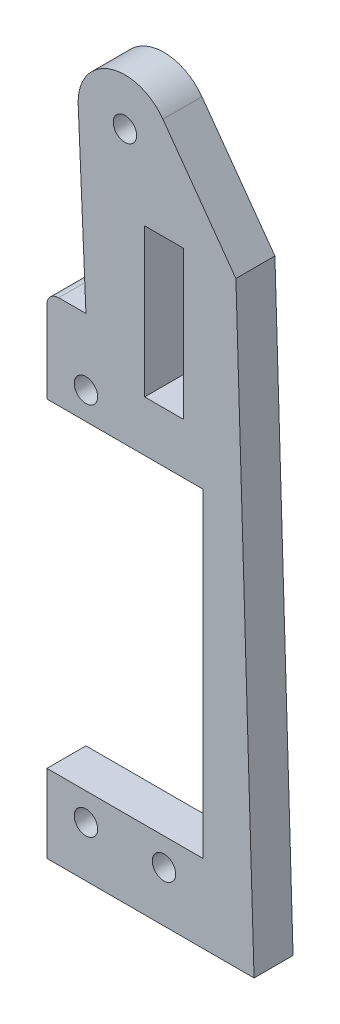
ISO-10303-21;
HEADER;
FILE_DESCRIPTION(('STEP AP214'),'2;1');
FILE_NAME('part.step','',(''),(''),'','','');
FILE_SCHEMA(('AUTOMOTIVE_DESIGN { 1 0 10303 214 1 1 1 1 }'));
ENDSEC;
DATA;
#1=APPLICATION_CONTEXT('core data for automotive mechanical design processes');
#2=APPLICATION_PROTOCOL_DEFINITION('international standard','automotive_design',2000,#1);
#3=PRODUCT_CONTEXT('',#1,'mechanical');
#4=PRODUCT('Part','Part','',(#3));
#5=PRODUCT_RELATED_PRODUCT_CATEGORY('part','',(#4));
#6=PRODUCT_DEFINITION_FORMATION('','',#4);
#7=PRODUCT_DEFINITION_CONTEXT('part definition',#1,'design');
#8=PRODUCT_DEFINITION('design','',#6,#7);
#9=PRODUCT_DEFINITION_SHAPE('','',#8);
#10=(LENGTH_UNIT() NAMED_UNIT(*) SI_UNIT(.MILLI.,.METRE.));
#11=(NAMED_UNIT(*) PLANE_ANGLE_UNIT() SI_UNIT($,.RADIAN.));
#12=(NAMED_UNIT(*) SI_UNIT($,.STERADIAN.) SOLID_ANGLE_UNIT());
#13=UNCERTAINTY_MEASURE_WITH_UNIT(LENGTH_MEASURE(1.E-05),#10,'distance_accuracy_value','');
#14=(GEOMETRIC_REPRESENTATION_CONTEXT(3) GLOBAL_UNCERTAINTY_ASSIGNED_CONTEXT((#13)) GLOBAL_UNIT_ASSIGNED_CONTEXT((#10,
#11,#12)) REPRESENTATION_CONTEXT('',''));
#15=CARTESIAN_POINT('',(0.,0.,0.));
#16=DIRECTION('',(0.,0.,1.));
#17=DIRECTION('',(1.,0.,0.));
#18=AXIS2_PLACEMENT_3D('',#15,#16,#17);
#19=CARTESIAN_POINT('',(17.5288568297002,0.,5.));
#20=DIRECTION('',(-1.,0.,0.));
#21=DIRECTION('',(0.,-1.,0.));
#22=AXIS2_PLACEMENT_3D('',#19,#20,#21);
#23=PLANE('',#22);
#24=DIRECTION('',(0.,1.,0.));
#25=VECTOR('',#24,1.);
#26=CARTESIAN_POINT('',(17.5288568297002,0.,0.));
#27=LINE('',#26,#25);
#28=CARTESIAN_POINT('',(17.5288568297002,57.4999999999998,0.));
#29=VERTEX_POINT('',#28);
#30=CARTESIAN_POINT('',(17.5288568297002,76.4999999999998,0.));
#31=VERTEX_POINT('',#30);
#32=EDGE_CURVE('E251',#29,#31,#27,.T.);
#33=ORIENTED_EDGE('',*,*,#32,.F.);
#34=DIRECTION('',(0.,0.,-1.));
#35=VECTOR('',#34,1.);
#36=CARTESIAN_POINT('',(17.5288568297002,57.4999999999998,5.));
#37=LINE('',#36,#35);
#38=CARTESIAN_POINT('',(17.5288568297002,57.4999999999998,5.));
#39=VERTEX_POINT('',#38);
#40=EDGE_CURVE('E273',#39,#29,#37,.T.);
#41=ORIENTED_EDGE('',*,*,#40,.F.);
#42=DIRECTION('',(0.,1.,0.));
#43=VECTOR('',#42,1.);
#44=CARTESIAN_POINT('',(17.5288568297002,0.,5.));
#45=LINE('',#44,#43);
#46=CARTESIAN_POINT('',(17.5288568297002,76.4999999999998,5.));
#47=VERTEX_POINT('',#46);
#48=EDGE_CURVE('E201',#39,#47,#45,.T.);
#49=ORIENTED_EDGE('',*,*,#48,.T.);
#50=DIRECTION('',(0.,0.,-1.));
#51=VECTOR('',#50,1.);
#52=CARTESIAN_POINT('',(17.5288568297002,76.4999999999998,5.));
#53=LINE('',#52,#51);
#54=EDGE_CURVE('E157',#47,#31,#53,.T.);
#55=ORIENTED_EDGE('',*,*,#54,.T.);
#56=EDGE_LOOP('',(#33,#41,#49,#55));
#57=FACE_BOUND('',#56,.T.);
#58=ADVANCED_FACE('F35',(#57),#23,.T.);
#59=CARTESIAN_POINT('',(0.,57.4999999999998,5.));
#60=DIRECTION('',(0.,1.,0.));
#61=DIRECTION('',(0.,0.,1.));
#62=AXIS2_PLACEMENT_3D('',#59,#60,#61);
#63=PLANE('',#62);
#64=DIRECTION('',(1.,0.,0.));
#65=VECTOR('',#64,1.);
#66=CARTESIAN_POINT('',(0.,57.4999999999998,0.));
#67=LINE('',#66,#65);
#68=CARTESIAN_POINT('',(12.5288568297002,57.4999999999998,0.));
#69=VERTEX_POINT('',#68);
#70=EDGE_CURVE('E254',#69,#29,#67,.T.);
#71=ORIENTED_EDGE('',*,*,#70,.F.);
#72=DIRECTION('',(0.,0.,-1.));
#73=VECTOR('',#72,1.);
#74=CARTESIAN_POINT('',(12.5288568297002,57.4999999999998,5.));
#75=LINE('',#74,#73);
#76=CARTESIAN_POINT('',(12.5288568297002,57.4999999999998,5.));
#77=VERTEX_POINT('',#76);
#78=EDGE_CURVE('E271',#77,#69,#75,.T.);
#79=ORIENTED_EDGE('',*,*,#78,.F.);
#80=DIRECTION('',(1.,0.,0.));
#81=VECTOR('',#80,1.);
#82=CARTESIAN_POINT('',(0.,57.4999999999998,5.));
#83=LINE('',#82,#81);
#84=EDGE_CURVE('E204',#77,#39,#83,.T.);
#85=ORIENTED_EDGE('',*,*,#84,.T.);
#86=ORIENTED_EDGE('',*,*,#40,.T.);
#87=EDGE_LOOP('',(#71,#79,#85,#86));
#88=FACE_BOUND('',#87,.T.);
#89=ADVANCED_FACE('F342',(#88),#63,.T.);
#90=CARTESIAN_POINT('',(12.5288568297002,0.,5.));
#91=DIRECTION('',(1.,0.,0.));
#92=DIRECTION('',(0.,1.,0.));
#93=AXIS2_PLACEMENT_3D('',#90,#91,#92);
#94=PLANE('',#93);
#95=DIRECTION('',(0.,-1.,0.));
#96=VECTOR('',#95,1.);
#97=CARTESIAN_POINT('',(12.5288568297002,0.,0.));
#98=LINE('',#97,#96);
#99=CARTESIAN_POINT('',(12.5288568297002,76.4999999999998,0.));
#100=VERTEX_POINT('',#99);
#101=EDGE_CURVE('E257',#100,#69,#98,.T.);
#102=ORIENTED_EDGE('',*,*,#101,.F.);
#103=DIRECTION('',(0.,0.,-1.));
#104=VECTOR('',#103,1.);
#105=CARTESIAN_POINT('',(12.5288568297002,76.4999999999998,5.));
#106=LINE('',#105,#104);
#107=CARTESIAN_POINT('',(12.5288568297002,76.4999999999998,5.));
#108=VERTEX_POINT('',#107);
#109=EDGE_CURVE('E269',#108,#100,#106,.T.);
#110=ORIENTED_EDGE('',*,*,#109,.F.);
#111=DIRECTION('',(0.,-1.,0.));
#112=VECTOR('',#111,1.);
#113=CARTESIAN_POINT('',(12.5288568297002,0.,5.));
#114=LINE('',#113,#112);
#115=EDGE_CURVE('E207',#108,#77,#114,.T.);
#116=ORIENTED_EDGE('',*,*,#115,.T.);
#117=ORIENTED_EDGE('',*,*,#78,.T.);
#118=EDGE_LOOP('',(#102,#110,#116,#117));
#119=FACE_BOUND('',#118,.T.);
#120=ADVANCED_FACE('F348',(#119),#94,.T.);
#121=CARTESIAN_POINT('',(9.99999999999968,85.9999999999998,5.));
#122=DIRECTION('',(0.,0.,-1.));
#123=DIRECTION('',(-1.,0.,0.));
#124=AXIS2_PLACEMENT_3D('',#121,#122,#123);
#125=CYLINDRICAL_SURFACE('',#124,5.99999999999998);
#126=CARTESIAN_POINT('',(9.99999999999968,85.9999999999998,0.));
#127=DIRECTION('',(0.,0.,1.));
#128=DIRECTION('',(1.,0.,0.));
#129=AXIS2_PLACEMENT_3D('',#126,#127,#128);
#130=CIRCLE('',#129,5.99999999999998);
#131=CARTESIAN_POINT('',(4.00572808162348,85.7378851996468,0.));
#132=VERTEX_POINT('',#131);
#133=CARTESIAN_POINT('',(14.8704483134797,89.5041023423582,0.));
#134=VERTEX_POINT('',#133);
#135=EDGE_CURVE('E153',#132,#134,#130,.F.);
#136=ORIENTED_EDGE('',*,*,#135,.F.);
#137=DIRECTION('',(0.,0.,-1.));
#138=VECTOR('',#137,1.);
#139=CARTESIAN_POINT('',(4.00572808162348,85.7378851996468,5.));
#140=LINE('',#139,#138);
#141=CARTESIAN_POINT('',(4.00572808162348,85.7378851996468,5.));
#142=VERTEX_POINT('',#141);
#143=EDGE_CURVE('E146',#142,#132,#140,.T.);
#144=ORIENTED_EDGE('',*,*,#143,.F.);
#145=CARTESIAN_POINT('',(9.99999999999968,85.9999999999998,5.));
#146=DIRECTION('',(0.,0.,1.));
#147=DIRECTION('',(1.,0.,0.));
#148=AXIS2_PLACEMENT_3D('',#145,#146,#147);
#149=CIRCLE('',#148,5.99999999999998);
#150=CARTESIAN_POINT('',(14.8704483134797,89.5041023423582,5.));
#151=VERTEX_POINT('',#150);
#152=EDGE_CURVE('E150',#142,#151,#149,.F.);
#153=ORIENTED_EDGE('',*,*,#152,.T.);
#154=DIRECTION('',(0.,0.,-1.));
#155=VECTOR('',#154,1.);
#156=CARTESIAN_POINT('',(14.8704483134797,89.5041023423582,5.));
#157=LINE('',#156,#155);
#158=EDGE_CURVE('E221',#151,#134,#157,.T.);
#159=ORIENTED_EDGE('',*,*,#158,.T.);
#160=EDGE_LOOP('',(#136,#144,#153,#159));
#161=FACE_BOUND('',#160,.T.);
#162=ADVANCED_FACE('F148',(#161),#125,.T.);
#163=CARTESIAN_POINT('',(7.74003568187289,0.338452765424198,5.));
#164=DIRECTION('',(0.9990453197294,0.0436858000588311,0.));
#165=DIRECTION('',(-0.0436858000588311,0.9990453197294,0.));
#166=AXIS2_PLACEMENT_3D('',#163,#164,#165);
#167=PLANE('',#166);
#168=DIRECTION('',(0.0436858000588311,-0.999045319729401,0.));
#169=VECTOR('',#168,1.);
#170=CARTESIAN_POINT('',(7.74003568187289,0.338452765424198,0.));
#171=LINE('',#170,#169);
#172=CARTESIAN_POINT('',(4.99999999999999,63.,0.));
#173=VERTEX_POINT('',#172);
#174=EDGE_CURVE('E223',#132,#173,#171,.T.);
#175=ORIENTED_EDGE('',*,*,#174,.T.);
#176=DIRECTION('',(0.,0.,-1.));
#177=VECTOR('',#176,1.);
#178=CARTESIAN_POINT('',(4.99999999999999,63.,5.));
#179=LINE('',#178,#177);
#180=CARTESIAN_POINT('',(4.99999999999999,63.,5.));
#181=VERTEX_POINT('',#180);
#182=EDGE_CURVE('E158',#181,#173,#179,.T.);
#183=ORIENTED_EDGE('',*,*,#182,.F.);
#184=DIRECTION('',(0.0436858000588311,-0.999045319729401,0.));
#185=VECTOR('',#184,1.);
#186=CARTESIAN_POINT('',(7.74003568187289,0.338452765424198,5.));
#187=LINE('',#186,#185);
#188=EDGE_CURVE('E162',#142,#181,#187,.T.);
#189=ORIENTED_EDGE('',*,*,#188,.F.);
#190=ORIENTED_EDGE('',*,*,#143,.T.);
#191=EDGE_LOOP('',(#175,#183,#189,#190));
#192=FACE_BOUND('',#191,.T.);
#193=ADVANCED_FACE('F163',(#192),#167,.F.);
#194=CARTESIAN_POINT('',(3.49720252756921E-13,63.,5.));
#195=DIRECTION('',(0.,1.,0.));
#196=DIRECTION('',(-1.,0.,0.));
#197=AXIS2_PLACEMENT_3D('',#194,#195,#196);
#198=PLANE('',#197);
#199=DIRECTION('',(1.,0.,0.));
#200=VECTOR('',#199,1.);
#201=CARTESIAN_POINT('',(3.49720252756921E-13,63.,0.));
#202=LINE('',#201,#200);
#203=CARTESIAN_POINT('',(1.49999999999996,63.,0.));
#204=VERTEX_POINT('',#203);
#205=EDGE_CURVE('E225',#204,#173,#202,.T.);
#206=ORIENTED_EDGE('',*,*,#205,.F.);
#207=DIRECTION('',(0.,0.,-1.));
#208=VECTOR('',#207,1.);
#209=CARTESIAN_POINT('',(1.49999999999996,63.,5.));
#210=LINE('',#209,#208);
#211=CARTESIAN_POINT('',(1.49999999999996,63.,5.));
#212=VERTEX_POINT('',#211);
#213=EDGE_CURVE('E43',#204,#212,#210,.F.);
#214=ORIENTED_EDGE('',*,*,#213,.T.);
#215=DIRECTION('',(1.,0.,0.));
#216=VECTOR('',#215,1.);
#217=CARTESIAN_POINT('',(3.49720252756921E-13,63.,5.));
#218=LINE('',#217,#216);
#219=EDGE_CURVE('E166',#212,#181,#218,.T.);
#220=ORIENTED_EDGE('',*,*,#219,.T.);
#221=ORIENTED_EDGE('',*,*,#182,.T.);
#222=EDGE_LOOP('',(#206,#214,#220,#221));
#223=FACE_BOUND('',#222,.T.);
#224=ADVANCED_FACE('F335',(#223),#198,.T.);
#225=CARTESIAN_POINT('',(0.,0.,5.));
#226=DIRECTION('',(1.,0.,0.));
#227=DIRECTION('',(0.,1.,0.));
#228=AXIS2_PLACEMENT_3D('',#225,#226,#227);
#229=PLANE('',#228);
#230=DIRECTION('',(0.,-1.,0.));
#231=VECTOR('',#230,1.);
#232=CARTESIAN_POINT('',(0.,0.,5.));
#233=LINE('',#232,#231);
#234=CARTESIAN_POINT('',(0.,61.5,5.));
#235=VERTEX_POINT('',#234);
#236=CARTESIAN_POINT('',(0.,51.,5.));
#237=VERTEX_POINT('',#236);
#238=EDGE_CURVE('E180',#235,#237,#233,.T.);
#239=ORIENTED_EDGE('',*,*,#238,.F.);
#240=DIRECTION('',(0.,0.,-1.));
#241=VECTOR('',#240,1.);
#242=CARTESIAN_POINT('',(0.,61.5,0.));
#243=LINE('',#242,#241);
#244=CARTESIAN_POINT('',(0.,61.5,0.));
#245=VERTEX_POINT('',#244);
#246=EDGE_CURVE('E275',#235,#245,#243,.T.);
#247=ORIENTED_EDGE('',*,*,#246,.T.);
#248=DIRECTION('',(0.,-1.,0.));
#249=VECTOR('',#248,1.);
#250=CARTESIAN_POINT('',(0.,0.,0.));
#251=LINE('',#250,#249);
#252=CARTESIAN_POINT('',(0.,51.,0.));
#253=VERTEX_POINT('',#252);
#254=EDGE_CURVE('E227',#245,#253,#251,.T.);
#255=ORIENTED_EDGE('',*,*,#254,.T.);
#256=DIRECTION('',(0.,0.,-1.));
#257=VECTOR('',#256,1.);
#258=CARTESIAN_POINT('',(0.,51.,5.));
#259=LINE('',#258,#257);
#260=EDGE_CURVE('E291',#237,#253,#259,.T.);
#261=ORIENTED_EDGE('',*,*,#260,.F.);
#262=EDGE_LOOP('',(#239,#247,#255,#261));
#263=FACE_BOUND('',#262,.T.);
#264=ADVANCED_FACE('F300',(#263),#229,.F.);
#265=CARTESIAN_POINT('',(0.,51.,5.));
#266=DIRECTION('',(0.,-1.,0.));
#267=DIRECTION('',(0.,0.,-1.));
#268=AXIS2_PLACEMENT_3D('',#265,#266,#267);
#269=PLANE('',#268);
#270=DIRECTION('',(-1.,0.,0.));
#271=VECTOR('',#270,1.);
#272=CARTESIAN_POINT('',(0.,51.,0.));
#273=LINE('',#272,#271);
#274=CARTESIAN_POINT('',(20.,51.,0.));
#275=VERTEX_POINT('',#274);
#276=EDGE_CURVE('E229',#275,#253,#273,.T.);
#277=ORIENTED_EDGE('',*,*,#276,.F.);
#278=DIRECTION('',(0.,0.,-1.));
#279=VECTOR('',#278,1.);
#280=CARTESIAN_POINT('',(20.,51.,5.));
#281=LINE('',#280,#279);
#282=CARTESIAN_POINT('',(20.,51.,5.));
#283=VERTEX_POINT('',#282);
#284=EDGE_CURVE('E289',#283,#275,#281,.T.);
#285=ORIENTED_EDGE('',*,*,#284,.F.);
#286=DIRECTION('',(-1.,0.,0.));
#287=VECTOR('',#286,1.);
#288=CARTESIAN_POINT('',(0.,51.,5.));
#289=LINE('',#288,#287);
#290=EDGE_CURVE('E182',#283,#237,#289,.T.);
#291=ORIENTED_EDGE('',*,*,#290,.T.);
#292=ORIENTED_EDGE('',*,*,#260,.T.);
#293=EDGE_LOOP('',(#277,#285,#291,#292));
#294=FACE_BOUND('',#293,.T.);
#295=ADVANCED_FACE('F310',(#294),#269,.T.);
#296=CARTESIAN_POINT('',(19.9999999999999,0.,5.));
#297=DIRECTION('',(-1.,0.,0.));
#298=DIRECTION('',(0.,-1.,0.));
#299=AXIS2_PLACEMENT_3D('',#296,#297,#298);
#300=PLANE('',#299);
#301=DIRECTION('',(0.,1.,0.));
#302=VECTOR('',#301,1.);
#303=CARTESIAN_POINT('',(19.9999999999999,0.,0.));
#304=LINE('',#303,#302);
#305=CARTESIAN_POINT('',(19.9999999999999,10.,0.));
#306=VERTEX_POINT('',#305);
#307=EDGE_CURVE('E232',#306,#275,#304,.T.);
#308=ORIENTED_EDGE('',*,*,#307,.F.);
#309=DIRECTION('',(0.,0.,-1.));
#310=VECTOR('',#309,1.);
#311=CARTESIAN_POINT('',(19.9999999999999,10.,5.));
#312=LINE('',#311,#310);
#313=CARTESIAN_POINT('',(19.9999999999999,10.,5.));
#314=VERTEX_POINT('',#313);
#315=EDGE_CURVE('E287',#314,#306,#312,.T.);
#316=ORIENTED_EDGE('',*,*,#315,.F.);
#317=DIRECTION('',(0.,1.,0.));
#318=VECTOR('',#317,1.);
#319=CARTESIAN_POINT('',(19.9999999999999,0.,5.));
#320=LINE('',#319,#318);
#321=EDGE_CURVE('E185',#314,#283,#320,.T.);
#322=ORIENTED_EDGE('',*,*,#321,.T.);
#323=ORIENTED_EDGE('',*,*,#284,.T.);
#324=EDGE_LOOP('',(#308,#316,#322,#323));
#325=FACE_BOUND('',#324,.T.);
#326=ADVANCED_FACE('F314',(#325),#300,.T.);
#327=CARTESIAN_POINT('',(0.,10.,5.));
#328=DIRECTION('',(0.,-1.,0.));
#329=DIRECTION('',(1.,0.,0.));
#330=AXIS2_PLACEMENT_3D('',#327,#328,#329);
#331=PLANE('',#330);
#332=DIRECTION('',(-1.,0.,0.));
#333=VECTOR('',#332,1.);
#334=CARTESIAN_POINT('',(0.,10.,0.));
#335=LINE('',#334,#333);
#336=CARTESIAN_POINT('',(0.,10.,0.));
#337=VERTEX_POINT('',#336);
#338=EDGE_CURVE('E235',#306,#337,#335,.T.);
#339=ORIENTED_EDGE('',*,*,#338,.T.);
#340=DIRECTION('',(0.,0.,-1.));
#341=VECTOR('',#340,1.);
#342=CARTESIAN_POINT('',(0.,10.,5.));
#343=LINE('',#342,#341);
#344=CARTESIAN_POINT('',(0.,10.,5.));
#345=VERTEX_POINT('',#344);
#346=EDGE_CURVE('E284',#345,#337,#343,.T.);
#347=ORIENTED_EDGE('',*,*,#346,.F.);
#348=DIRECTION('',(-1.,0.,0.));
#349=VECTOR('',#348,1.);
#350=CARTESIAN_POINT('',(0.,10.,5.));
#351=LINE('',#350,#349);
#352=EDGE_CURVE('E188',#314,#345,#351,.T.);
#353=ORIENTED_EDGE('',*,*,#352,.F.);
#354=ORIENTED_EDGE('',*,*,#315,.T.);
#355=EDGE_LOOP('',(#339,#347,#353,#354));
#356=FACE_BOUND('',#355,.T.);
#357=ADVANCED_FACE('F318',(#356),#331,.F.);
#358=CARTESIAN_POINT('',(0.,0.,5.));
#359=DIRECTION('',(1.,0.,0.));
#360=DIRECTION('',(0.,1.,0.));
#361=AXIS2_PLACEMENT_3D('',#358,#359,#360);
#362=PLANE('',#361);
#363=DIRECTION('',(0.,-1.,0.));
#364=VECTOR('',#363,1.);
#365=CARTESIAN_POINT('',(0.,0.,0.));
#366=LINE('',#365,#364);
#367=CARTESIAN_POINT('',(0.,0.,0.));
#368=VERTEX_POINT('',#367);
#369=EDGE_CURVE('E237',#337,#368,#366,.T.);
#370=ORIENTED_EDGE('',*,*,#369,.T.);
#371=DIRECTION('',(0.,0.,-1.));
#372=VECTOR('',#371,1.);
#373=CARTESIAN_POINT('',(0.,0.,5.));
#374=LINE('',#373,#372);
#375=CARTESIAN_POINT('',(0.,0.,5.));
#376=VERTEX_POINT('',#375);
#377=EDGE_CURVE('E281',#376,#368,#374,.T.);
#378=ORIENTED_EDGE('',*,*,#377,.F.);
#379=DIRECTION('',(0.,-1.,0.));
#380=VECTOR('',#379,1.);
#381=CARTESIAN_POINT('',(0.,0.,5.));
#382=LINE('',#381,#380);
#383=EDGE_CURVE('E190',#345,#376,#382,.T.);
#384=ORIENTED_EDGE('',*,*,#383,.F.);
#385=ORIENTED_EDGE('',*,*,#346,.T.);
#386=EDGE_LOOP('',(#370,#378,#384,#385));
#387=FACE_BOUND('',#386,.T.);
#388=ADVANCED_FACE('F324',(#387),#362,.F.);
#389=CARTESIAN_POINT('',(0.,0.,5.));
#390=DIRECTION('',(0.,1.,0.));
#391=DIRECTION('',(-1.,0.,0.));
#392=AXIS2_PLACEMENT_3D('',#389,#390,#391);
#393=PLANE('',#392);
#394=DIRECTION('',(1.,0.,0.));
#395=VECTOR('',#394,1.);
#396=CARTESIAN_POINT('',(0.,0.,0.));
#397=LINE('',#396,#395);
#398=CARTESIAN_POINT('',(26.5541314453759,0.,0.));
#399=VERTEX_POINT('',#398);
#400=EDGE_CURVE('E239',#368,#399,#397,.T.);
#401=ORIENTED_EDGE('',*,*,#400,.T.);
#402=DIRECTION('',(0.,0.,-1.));
#403=VECTOR('',#402,1.);
#404=CARTESIAN_POINT('',(26.5541314453759,0.,5.));
#405=LINE('',#404,#403);
#406=CARTESIAN_POINT('',(26.5541314453759,0.,5.));
#407=VERTEX_POINT('',#406);
#408=EDGE_CURVE('E279',#407,#399,#405,.T.);
#409=ORIENTED_EDGE('',*,*,#408,.F.);
#410=DIRECTION('',(1.,0.,0.));
#411=VECTOR('',#410,1.);
#412=CARTESIAN_POINT('',(0.,0.,5.));
#413=LINE('',#412,#411);
#414=EDGE_CURVE('E192',#376,#407,#413,.T.);
#415=ORIENTED_EDGE('',*,*,#414,.F.);
#416=ORIENTED_EDGE('',*,*,#377,.T.);
#417=EDGE_LOOP('',(#401,#409,#415,#416));
#418=FACE_BOUND('',#417,.T.);
#419=ADVANCED_FACE('F328',(#418),#393,.F.);
#420=CARTESIAN_POINT('',(26.5295690311156,0.807236188911825,5.));
#421=DIRECTION('',(0.999537395961129,0.0304137152489801,0.));
#422=DIRECTION('',(-0.0304137152489801,0.999537395961129,0.));
#423=AXIS2_PLACEMENT_3D('',#420,#421,#422);
#424=PLANE('',#423);
#425=DIRECTION('',(0.0304137152489801,-0.999537395961129,0.));
#426=VECTOR('',#425,1.);
#427=CARTESIAN_POINT('',(26.5295690311156,0.807236188911825,0.));
#428=LINE('',#427,#426);
#429=CARTESIAN_POINT('',(24.2264054133651,76.4999999999998,0.));
#430=VERTEX_POINT('',#429);
#431=EDGE_CURVE('E242',#430,#399,#428,.T.);
#432=ORIENTED_EDGE('',*,*,#431,.F.);
#433=DIRECTION('',(0.,0.,-1.));
#434=VECTOR('',#433,1.);
#435=CARTESIAN_POINT('',(24.2264054133651,76.4999999999998,5.));
#436=LINE('',#435,#434);
#437=CARTESIAN_POINT('',(24.2264054133651,76.4999999999998,5.));
#438=VERTEX_POINT('',#437);
#439=EDGE_CURVE('E277',#438,#430,#436,.T.);
#440=ORIENTED_EDGE('',*,*,#439,.F.);
#441=DIRECTION('',(0.0304137152489801,-0.999537395961129,0.));
#442=VECTOR('',#441,1.);
#443=CARTESIAN_POINT('',(26.5295690311156,0.807236188911825,5.));
#444=LINE('',#443,#442);
#445=EDGE_CURVE('E194',#438,#407,#444,.T.);
#446=ORIENTED_EDGE('',*,*,#445,.T.);
#447=ORIENTED_EDGE('',*,*,#408,.T.);
#448=EDGE_LOOP('',(#432,#440,#446,#447));
#449=FACE_BOUND('',#448,.T.);
#450=ADVANCED_FACE('F331',(#449),#424,.T.);
#451=CARTESIAN_POINT('',(15.,6.50000000000002,5.));
#452=DIRECTION('',(0.,0.,-1.));
#453=DIRECTION('',(-1.,0.,0.));
#454=AXIS2_PLACEMENT_3D('',#451,#452,#453);
#455=CYLINDRICAL_SURFACE('',#454,1.5);
#456=CARTESIAN_POINT('',(15.,6.50000000000002,5.));
#457=DIRECTION('',(0.,0.,1.));
#458=DIRECTION('',(1.,0.,0.));
#459=AXIS2_PLACEMENT_3D('',#456,#457,#458);
#460=CIRCLE('',#459,1.5);
#461=CARTESIAN_POINT('',(16.5,6.50000000000002,5.));
#462=VERTEX_POINT('',#461);
#463=EDGE_CURVE('E215',#462,#462,#460,.T.);
#464=ORIENTED_EDGE('',*,*,#463,.T.);
#465=EDGE_LOOP('',(#464));
#466=FACE_BOUND('',#465,.T.);
#467=CARTESIAN_POINT('',(15.,6.50000000000002,0.));
#468=DIRECTION('',(0.,0.,1.));
#469=DIRECTION('',(1.,0.,0.));
#470=AXIS2_PLACEMENT_3D('',#467,#468,#469);
#471=CIRCLE('',#470,1.5);
#472=CARTESIAN_POINT('',(16.5,6.50000000000002,0.));
#473=VERTEX_POINT('',#472);
#474=EDGE_CURVE('E176',#473,#473,#471,.T.);
#475=ORIENTED_EDGE('',*,*,#474,.F.);
#476=EDGE_LOOP('',(#475));
#477=FACE_BOUND('',#476,.T.);
#478=ADVANCED_FACE('F364',(#466,#477),#455,.F.);
#479=CARTESIAN_POINT('',(4.99999999999995,54.5,5.));
#480=DIRECTION('',(0.,0.,-1.));
#481=DIRECTION('',(-1.,0.,0.));
#482=AXIS2_PLACEMENT_3D('',#479,#480,#481);
#483=CYLINDRICAL_SURFACE('',#482,1.5);
#484=CARTESIAN_POINT('',(4.99999999999995,54.5,5.));
#485=DIRECTION('',(0.,0.,1.));
#486=DIRECTION('',(1.,0.,0.));
#487=AXIS2_PLACEMENT_3D('',#484,#485,#486);
#488=CIRCLE('',#487,1.5);
#489=CARTESIAN_POINT('',(6.49999999999995,54.5,5.));
#490=VERTEX_POINT('',#489);
#491=EDGE_CURVE('E212',#490,#490,#488,.T.);
#492=ORIENTED_EDGE('',*,*,#491,.T.);
#493=EDGE_LOOP('',(#492));
#494=FACE_BOUND('',#493,.T.);
#495=CARTESIAN_POINT('',(4.99999999999995,54.5,0.));
#496=DIRECTION('',(0.,0.,1.));
#497=DIRECTION('',(1.,0.,0.));
#498=AXIS2_PLACEMENT_3D('',#495,#496,#497);
#499=CIRCLE('',#498,1.5);
#500=CARTESIAN_POINT('',(6.49999999999995,54.5,0.));
#501=VERTEX_POINT('',#500);
#502=EDGE_CURVE('E263',#501,#501,#499,.T.);
#503=ORIENTED_EDGE('',*,*,#502,.F.);
#504=EDGE_LOOP('',(#503));
#505=FACE_BOUND('',#504,.T.);
#506=ADVANCED_FACE('F391',(#494,#505),#483,.F.);
#507=CARTESIAN_POINT('',(0.,76.4999999999998,5.));
#508=DIRECTION('',(0.,1.,0.));
#509=DIRECTION('',(0.,0.,1.));
#510=AXIS2_PLACEMENT_3D('',#507,#508,#509);
#511=PLANE('',#510);
#512=DIRECTION('',(1.,0.,0.));
#513=VECTOR('',#512,1.);
#514=CARTESIAN_POINT('',(0.,76.4999999999998,0.));
#515=LINE('',#514,#513);
#516=EDGE_CURVE('E260',#100,#31,#515,.T.);
#517=ORIENTED_EDGE('',*,*,#516,.T.);
#518=ORIENTED_EDGE('',*,*,#54,.F.);
#519=DIRECTION('',(1.,0.,0.));
#520=VECTOR('',#519,1.);
#521=CARTESIAN_POINT('',(0.,76.4999999999998,5.));
#522=LINE('',#521,#520);
#523=EDGE_CURVE('E210',#108,#47,#522,.T.);
#524=ORIENTED_EDGE('',*,*,#523,.F.);
#525=ORIENTED_EDGE('',*,*,#109,.T.);
#526=EDGE_LOOP('',(#517,#518,#524,#525));
#527=FACE_BOUND('',#526,.T.);
#528=ADVANCED_FACE('F357',(#527),#511,.F.);
#529=CARTESIAN_POINT('',(9.99999999999968,85.9999999999998,5.));
#530=DIRECTION('',(0.,0.,-1.));
#531=DIRECTION('',(-1.,0.,0.));
#532=AXIS2_PLACEMENT_3D('',#529,#530,#531);
#533=CYLINDRICAL_SURFACE('',#532,1.5);
#534=CARTESIAN_POINT('',(9.99999999999968,85.9999999999998,5.));
#535=DIRECTION('',(0.,0.,1.));
#536=DIRECTION('',(1.,0.,0.));
#537=AXIS2_PLACEMENT_3D('',#534,#535,#536);
#538=CIRCLE('',#537,1.5);
#539=CARTESIAN_POINT('',(11.4999999999997,85.9999999999998,5.));
#540=VERTEX_POINT('',#539);
#541=EDGE_CURVE('E198',#540,#540,#538,.T.);
#542=ORIENTED_EDGE('',*,*,#541,.T.);
#543=EDGE_LOOP('',(#542));
#544=FACE_BOUND('',#543,.T.);
#545=CARTESIAN_POINT('',(9.99999999999968,85.9999999999998,0.));
#546=DIRECTION('',(0.,0.,1.));
#547=DIRECTION('',(1.,0.,0.));
#548=AXIS2_PLACEMENT_3D('',#545,#546,#547);
#549=CIRCLE('',#548,1.5);
#550=CARTESIAN_POINT('',(11.4999999999997,85.9999999999998,0.));
#551=VERTEX_POINT('',#550);
#552=EDGE_CURVE('E248',#551,#551,#549,.T.);
#553=ORIENTED_EDGE('',*,*,#552,.F.);
#554=EDGE_LOOP('',(#553));
#555=FACE_BOUND('',#554,.T.);
#556=ADVANCED_FACE('F354',(#544,#555),#533,.F.);
#557=CARTESIAN_POINT('',(52.2297791827129,37.5773398659155,5.));
#558=DIRECTION('',(0.811741385579969,0.584017057059733,0.));
#559=DIRECTION('',(-0.584017057059733,0.811741385579969,0.));
#560=AXIS2_PLACEMENT_3D('',#557,#558,#559);
#561=PLANE('',#560);
#562=DIRECTION('',(0.584017057059733,-0.811741385579969,0.));
#563=VECTOR('',#562,1.);
#564=CARTESIAN_POINT('',(52.2297791827129,37.5773398659155,0.));
#565=LINE('',#564,#563);
#566=EDGE_CURVE('E245',#134,#430,#565,.T.);
#567=ORIENTED_EDGE('',*,*,#566,.F.);
#568=ORIENTED_EDGE('',*,*,#158,.F.);
#569=DIRECTION('',(0.584017057059733,-0.811741385579969,0.));
#570=VECTOR('',#569,1.);
#571=CARTESIAN_POINT('',(52.2297791827129,37.5773398659155,5.));
#572=LINE('',#571,#570);
#573=EDGE_CURVE('E172',#151,#438,#572,.T.);
#574=ORIENTED_EDGE('',*,*,#573,.T.);
#575=ORIENTED_EDGE('',*,*,#439,.T.);
#576=EDGE_LOOP('',(#567,#568,#574,#575));
#577=FACE_BOUND('',#576,.T.);
#578=ADVANCED_FACE('F334',(#577),#561,.T.);
#579=CARTESIAN_POINT('',(4.99999999999995,6.50000000000002,5.));
#580=DIRECTION('',(0.,0.,-1.));
#581=DIRECTION('',(-1.,0.,0.));
#582=AXIS2_PLACEMENT_3D('',#579,#580,#581);
#583=CYLINDRICAL_SURFACE('',#582,1.5);
#584=CARTESIAN_POINT('',(4.99999999999995,6.50000000000002,5.));
#585=DIRECTION('',(0.,0.,1.));
#586=DIRECTION('',(1.,0.,0.));
#587=AXIS2_PLACEMENT_3D('',#584,#585,#586);
#588=CIRCLE('',#587,1.5);
#589=CARTESIAN_POINT('',(6.49999999999995,6.50000000000002,5.));
#590=VERTEX_POINT('',#589);
#591=EDGE_CURVE('E218',#590,#590,#588,.F.);
#592=ORIENTED_EDGE('',*,*,#591,.F.);
#593=EDGE_LOOP('',(#592));
#594=FACE_BOUND('',#593,.T.);
#595=CARTESIAN_POINT('',(4.99999999999995,6.50000000000002,0.));
#596=DIRECTION('',(0.,0.,1.));
#597=DIRECTION('',(1.,0.,0.));
#598=AXIS2_PLACEMENT_3D('',#595,#596,#597);
#599=CIRCLE('',#598,1.5);
#600=CARTESIAN_POINT('',(6.49999999999995,6.50000000000002,0.));
#601=VERTEX_POINT('',#600);
#602=EDGE_CURVE('E173',#601,#601,#599,.F.);
#603=ORIENTED_EDGE('',*,*,#602,.T.);
#604=EDGE_LOOP('',(#603));
#605=FACE_BOUND('',#604,.T.);
#606=ADVANCED_FACE('F361',(#594,#605),#583,.F.);
#607=CARTESIAN_POINT('',(0.,0.,5.));
#608=DIRECTION('',(0.,0.,1.));
#609=DIRECTION('',(1.,0.,0.));
#610=AXIS2_PLACEMENT_3D('',#607,#608,#609);
#611=PLANE('',#610);
#612=ORIENTED_EDGE('',*,*,#219,.F.);
#613=CARTESIAN_POINT('',(1.49999999999995,61.5,5.));
#614=DIRECTION('',(0.,0.,1.));
#615=DIRECTION('',(1.,0.,0.));
#616=AXIS2_PLACEMENT_3D('',#613,#614,#615);
#617=CIRCLE('',#616,1.5);
#618=EDGE_CURVE('E11',#212,#235,#617,.T.);
#619=ORIENTED_EDGE('',*,*,#618,.T.);
#620=ORIENTED_EDGE('',*,*,#238,.T.);
#621=ORIENTED_EDGE('',*,*,#290,.F.);
#622=ORIENTED_EDGE('',*,*,#321,.F.);
#623=ORIENTED_EDGE('',*,*,#352,.T.);
#624=ORIENTED_EDGE('',*,*,#383,.T.);
#625=ORIENTED_EDGE('',*,*,#414,.T.);
#626=ORIENTED_EDGE('',*,*,#445,.F.);
#627=ORIENTED_EDGE('',*,*,#573,.F.);
#628=ORIENTED_EDGE('',*,*,#152,.F.);
#629=ORIENTED_EDGE('',*,*,#188,.T.);
#630=EDGE_LOOP('',(#612,#619,#620,#621,#622,#623,#624,#625,#626,#627,#628,#629));
#631=FACE_BOUND('',#630,.T.);
#632=ORIENTED_EDGE('',*,*,#541,.F.);
#633=EDGE_LOOP('',(#632));
#634=FACE_BOUND('',#633,.T.);
#635=ORIENTED_EDGE('',*,*,#48,.F.);
#636=ORIENTED_EDGE('',*,*,#84,.F.);
#637=ORIENTED_EDGE('',*,*,#115,.F.);
#638=ORIENTED_EDGE('',*,*,#523,.T.);
#639=EDGE_LOOP('',(#635,#636,#637,#638));
#640=FACE_BOUND('',#639,.T.);
#641=ORIENTED_EDGE('',*,*,#491,.F.);
#642=EDGE_LOOP('',(#641));
#643=FACE_BOUND('',#642,.T.);
#644=ORIENTED_EDGE('',*,*,#463,.F.);
#645=EDGE_LOOP('',(#644));
#646=FACE_BOUND('',#645,.T.);
#647=ORIENTED_EDGE('',*,*,#591,.T.);
#648=EDGE_LOOP('',(#647));
#649=FACE_BOUND('',#648,.T.);
#650=ADVANCED_FACE('F168',(#631,#634,#640,#643,#646,#649),#611,.T.);
#651=CARTESIAN_POINT('',(0.,0.,0.));
#652=DIRECTION('',(0.,0.,1.));
#653=DIRECTION('',(1.,0.,0.));
#654=AXIS2_PLACEMENT_3D('',#651,#652,#653);
#655=PLANE('',#654);
#656=ORIENTED_EDGE('',*,*,#254,.F.);
#657=CARTESIAN_POINT('',(1.49999999999995,61.5,0.));
#658=DIRECTION('',(0.,0.,1.));
#659=DIRECTION('',(1.,0.,0.));
#660=AXIS2_PLACEMENT_3D('',#657,#658,#659);
#661=CIRCLE('',#660,1.5);
#662=EDGE_CURVE('E57',#245,#204,#661,.F.);
#663=ORIENTED_EDGE('',*,*,#662,.T.);
#664=ORIENTED_EDGE('',*,*,#205,.T.);
#665=ORIENTED_EDGE('',*,*,#174,.F.);
#666=ORIENTED_EDGE('',*,*,#135,.T.);
#667=ORIENTED_EDGE('',*,*,#566,.T.);
#668=ORIENTED_EDGE('',*,*,#431,.T.);
#669=ORIENTED_EDGE('',*,*,#400,.F.);
#670=ORIENTED_EDGE('',*,*,#369,.F.);
#671=ORIENTED_EDGE('',*,*,#338,.F.);
#672=ORIENTED_EDGE('',*,*,#307,.T.);
#673=ORIENTED_EDGE('',*,*,#276,.T.);
#674=EDGE_LOOP('',(#656,#663,#664,#665,#666,#667,#668,#669,#670,#671,#672,#673));
#675=FACE_BOUND('',#674,.T.);
#676=ORIENTED_EDGE('',*,*,#552,.T.);
#677=EDGE_LOOP('',(#676));
#678=FACE_BOUND('',#677,.T.);
#679=ORIENTED_EDGE('',*,*,#32,.T.);
#680=ORIENTED_EDGE('',*,*,#516,.F.);
#681=ORIENTED_EDGE('',*,*,#101,.T.);
#682=ORIENTED_EDGE('',*,*,#70,.T.);
#683=EDGE_LOOP('',(#679,#680,#681,#682));
#684=FACE_BOUND('',#683,.T.);
#685=ORIENTED_EDGE('',*,*,#502,.T.);
#686=EDGE_LOOP('',(#685));
#687=FACE_BOUND('',#686,.T.);
#688=ORIENTED_EDGE('',*,*,#474,.T.);
#689=EDGE_LOOP('',(#688));
#690=FACE_BOUND('',#689,.T.);
#691=ORIENTED_EDGE('',*,*,#602,.F.);
#692=EDGE_LOOP('',(#691));
#693=FACE_BOUND('',#692,.T.);
#694=ADVANCED_FACE('F304',(#675,#678,#684,#687,#690,#693),#655,.F.);
#695=CARTESIAN_POINT('',(1.49999999999995,61.5,5.));
#696=DIRECTION('',(0.,0.,1.));
#697=DIRECTION('',(1.,0.,0.));
#698=AXIS2_PLACEMENT_3D('',#695,#696,#697);
#699=CYLINDRICAL_SURFACE('',#698,1.5);
#700=ORIENTED_EDGE('',*,*,#618,.F.);
#701=ORIENTED_EDGE('',*,*,#213,.F.);
#702=ORIENTED_EDGE('',*,*,#662,.F.);
#703=ORIENTED_EDGE('',*,*,#246,.F.);
#704=EDGE_LOOP('',(#700,#701,#702,#703));
#705=FACE_BOUND('',#704,.T.);
#706=ADVANCED_FACE('F37',(#705),#699,.T.);
#707=CLOSED_SHELL('',(#58,#89,#120,#162,#193,#224,#264,#295,#326,#357,#388,#419,#450,#478,#506,
#528,#556,#578,#606,#650,#694,#706));
#708=MANIFOLD_SOLID_BREP('B2',#707);
#709=ADVANCED_BREP_SHAPE_REPRESENTATION('',(#18,#708),#14);
#710=SHAPE_DEFINITION_REPRESENTATION(#9,#709);
ENDSEC;
END-ISO-10303-21;
